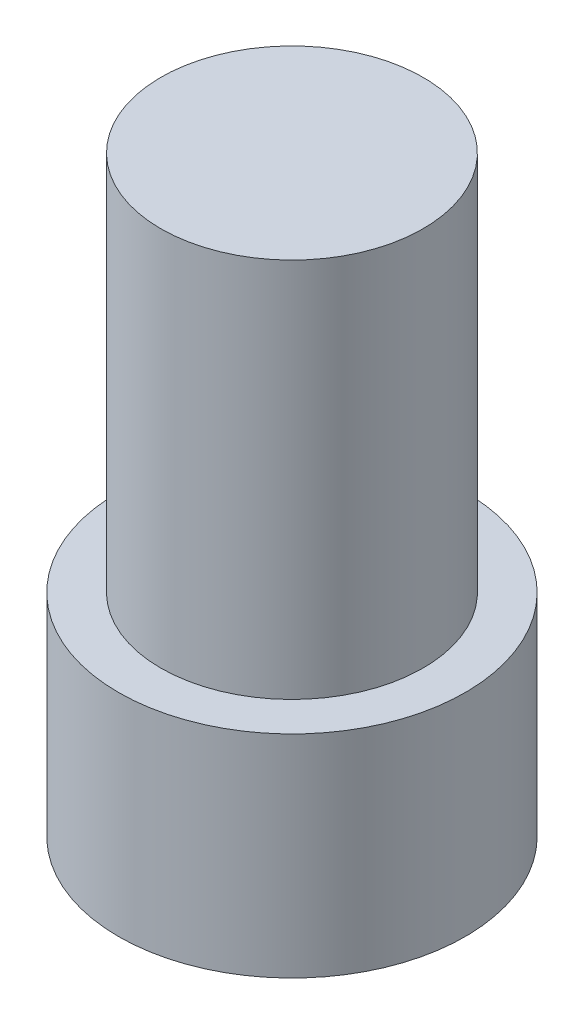
ISO-10303-21;
HEADER;
FILE_DESCRIPTION(('STEP AP214'),'2;1');
FILE_NAME('part.step','',(''),(''),'','','');
FILE_SCHEMA(('AUTOMOTIVE_DESIGN { 1 0 10303 214 1 1 1 1 }'));
ENDSEC;
DATA;
#1=APPLICATION_CONTEXT('core data for automotive mechanical design processes');
#2=APPLICATION_PROTOCOL_DEFINITION('international standard','automotive_design',2000,#1);
#3=PRODUCT_CONTEXT('',#1,'mechanical');
#4=PRODUCT('Part','Part','',(#3));
#5=PRODUCT_RELATED_PRODUCT_CATEGORY('part','',(#4));
#6=PRODUCT_DEFINITION_FORMATION('','',#4);
#7=PRODUCT_DEFINITION_CONTEXT('part definition',#1,'design');
#8=PRODUCT_DEFINITION('design','',#6,#7);
#9=PRODUCT_DEFINITION_SHAPE('','',#8);
#10=(LENGTH_UNIT() NAMED_UNIT(*) SI_UNIT(.MILLI.,.METRE.));
#11=(NAMED_UNIT(*) PLANE_ANGLE_UNIT() SI_UNIT($,.RADIAN.));
#12=(NAMED_UNIT(*) SI_UNIT($,.STERADIAN.) SOLID_ANGLE_UNIT());
#13=UNCERTAINTY_MEASURE_WITH_UNIT(LENGTH_MEASURE(1.E-05),#10,'distance_accuracy_value','');
#14=(GEOMETRIC_REPRESENTATION_CONTEXT(3) GLOBAL_UNCERTAINTY_ASSIGNED_CONTEXT((#13)) GLOBAL_UNIT_ASSIGNED_CONTEXT((#10,
#11,#12)) REPRESENTATION_CONTEXT('',''));
#15=CARTESIAN_POINT('',(0.,0.,0.));
#16=DIRECTION('',(0.,0.,1.));
#17=DIRECTION('',(1.,0.,0.));
#18=AXIS2_PLACEMENT_3D('',#15,#16,#17);
#19=CARTESIAN_POINT('',(0.,31.75,0.));
#20=DIRECTION('',(0.,1.,0.));
#21=DIRECTION('',(0.,0.,1.));
#22=AXIS2_PLACEMENT_3D('',#19,#20,#21);
#23=PLANE('',#22);
#24=CARTESIAN_POINT('',(0.,31.75,0.));
#25=DIRECTION('',(0.,1.,0.));
#26=DIRECTION('',(0.,0.,1.));
#27=AXIS2_PLACEMENT_3D('',#24,#25,#26);
#28=CIRCLE('',#27,26.0416706872887);
#29=CARTESIAN_POINT('',(0.,31.75,26.0416706872887));
#30=VERTEX_POINT('',#29);
#31=EDGE_CURVE('E10',#30,#30,#28,.T.);
#32=ORIENTED_EDGE('',*,*,#31,.T.);
#33=EDGE_LOOP('',(#32));
#34=FACE_BOUND('',#33,.T.);
#35=CARTESIAN_POINT('',(0.,31.75,0.));
#36=DIRECTION('',(0.,1.,0.));
#37=DIRECTION('',(0.,0.,1.));
#38=AXIS2_PLACEMENT_3D('',#35,#36,#37);
#39=CIRCLE('',#38,19.6984415957377);
#40=CARTESIAN_POINT('',(0.,31.75,19.6984415957377));
#41=VERTEX_POINT('',#40);
#42=EDGE_CURVE('E42',#41,#41,#39,.T.);
#43=ORIENTED_EDGE('',*,*,#42,.F.);
#44=EDGE_LOOP('',(#43));
#45=FACE_BOUND('',#44,.T.);
#46=ADVANCED_FACE('F29',(#34,#45),#23,.T.);
#47=CARTESIAN_POINT('',(0.,31.75,0.));
#48=DIRECTION('',(0.,-1.,0.));
#49=DIRECTION('',(0.,0.,-1.));
#50=AXIS2_PLACEMENT_3D('',#47,#48,#49);
#51=CYLINDRICAL_SURFACE('',#50,26.0416706872887);
#52=ORIENTED_EDGE('',*,*,#31,.F.);
#53=EDGE_LOOP('',(#52));
#54=FACE_BOUND('',#53,.T.);
#55=CARTESIAN_POINT('',(0.,0.,0.));
#56=DIRECTION('',(0.,1.,0.));
#57=DIRECTION('',(0.,0.,1.));
#58=AXIS2_PLACEMENT_3D('',#55,#56,#57);
#59=CIRCLE('',#58,26.0416706872887);
#60=CARTESIAN_POINT('',(0.,0.,26.0416706872887));
#61=VERTEX_POINT('',#60);
#62=EDGE_CURVE('E33',#61,#61,#59,.T.);
#63=ORIENTED_EDGE('',*,*,#62,.T.);
#64=EDGE_LOOP('',(#63));
#65=FACE_BOUND('',#64,.T.);
#66=ADVANCED_FACE('F31',(#54,#65),#51,.T.);
#67=CARTESIAN_POINT('',(0.,0.,0.));
#68=DIRECTION('',(0.,1.,0.));
#69=DIRECTION('',(0.,0.,1.));
#70=AXIS2_PLACEMENT_3D('',#67,#68,#69);
#71=PLANE('',#70);
#72=ORIENTED_EDGE('',*,*,#62,.F.);
#73=EDGE_LOOP('',(#72));
#74=FACE_BOUND('',#73,.T.);
#75=ADVANCED_FACE('F53',(#74),#71,.F.);
#76=CARTESIAN_POINT('',(0.,88.9,0.));
#77=DIRECTION('',(0.,-1.,0.));
#78=DIRECTION('',(0.,0.,-1.));
#79=AXIS2_PLACEMENT_3D('',#76,#77,#78);
#80=CYLINDRICAL_SURFACE('',#79,19.6984415957377);
#81=CARTESIAN_POINT('',(0.,88.9,0.));
#82=DIRECTION('',(0.,1.,0.));
#83=DIRECTION('',(0.,0.,1.));
#84=AXIS2_PLACEMENT_3D('',#81,#82,#83);
#85=CIRCLE('',#84,19.6984415957377);
#86=CARTESIAN_POINT('',(0.,88.9,19.6984415957377));
#87=VERTEX_POINT('',#86);
#88=EDGE_CURVE('E40',#87,#87,#85,.T.);
#89=ORIENTED_EDGE('',*,*,#88,.F.);
#90=EDGE_LOOP('',(#89));
#91=FACE_BOUND('',#90,.T.);
#92=ORIENTED_EDGE('',*,*,#42,.T.);
#93=EDGE_LOOP('',(#92));
#94=FACE_BOUND('',#93,.T.);
#95=ADVANCED_FACE('F50',(#91,#94),#80,.T.);
#96=CARTESIAN_POINT('',(0.,88.9,0.));
#97=DIRECTION('',(0.,1.,0.));
#98=DIRECTION('',(0.,0.,1.));
#99=AXIS2_PLACEMENT_3D('',#96,#97,#98);
#100=PLANE('',#99);
#101=ORIENTED_EDGE('',*,*,#88,.T.);
#102=EDGE_LOOP('',(#101));
#103=FACE_BOUND('',#102,.T.);
#104=ADVANCED_FACE('F48',(#103),#100,.T.);
#105=CLOSED_SHELL('',(#46,#66,#75,#95,#104));
#106=MANIFOLD_SOLID_BREP('B2',#105);
#107=ADVANCED_BREP_SHAPE_REPRESENTATION('',(#18,#106),#14);
#108=SHAPE_DEFINITION_REPRESENTATION(#9,#107);
ENDSEC;
END-ISO-10303-21;
